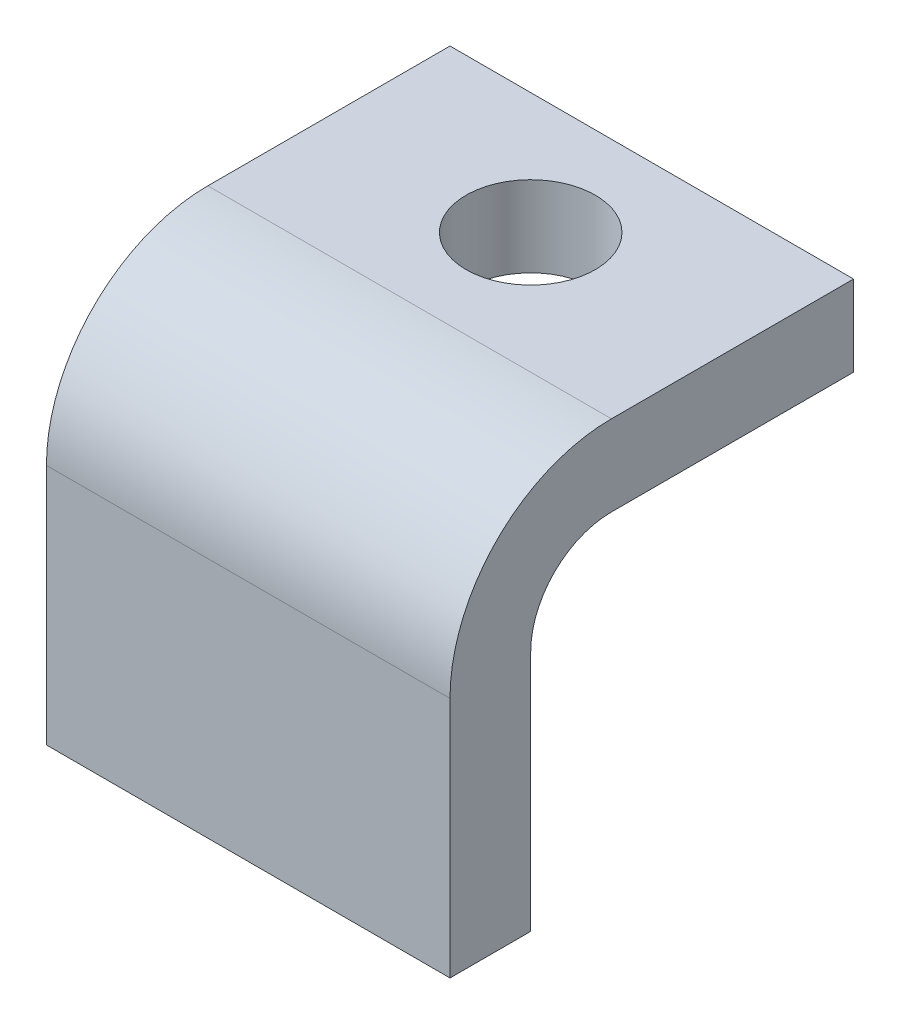
ISO-10303-21;
HEADER;
FILE_DESCRIPTION(('STEP AP214'),'2;1');
FILE_NAME('part.step','',(''),(''),'','','');
FILE_SCHEMA(('AUTOMOTIVE_DESIGN { 1 0 10303 214 1 1 1 1 }'));
ENDSEC;
DATA;
#1=APPLICATION_CONTEXT('core data for automotive mechanical design processes');
#2=APPLICATION_PROTOCOL_DEFINITION('international standard','automotive_design',2000,#1);
#3=PRODUCT_CONTEXT('',#1,'mechanical');
#4=PRODUCT('Part','Part','',(#3));
#5=PRODUCT_RELATED_PRODUCT_CATEGORY('part','',(#4));
#6=PRODUCT_DEFINITION_FORMATION('','',#4);
#7=PRODUCT_DEFINITION_CONTEXT('part definition',#1,'design');
#8=PRODUCT_DEFINITION('design','',#6,#7);
#9=PRODUCT_DEFINITION_SHAPE('','',#8);
#10=(LENGTH_UNIT() NAMED_UNIT(*) SI_UNIT(.MILLI.,.METRE.));
#11=(NAMED_UNIT(*) PLANE_ANGLE_UNIT() SI_UNIT($,.RADIAN.));
#12=(NAMED_UNIT(*) SI_UNIT($,.STERADIAN.) SOLID_ANGLE_UNIT());
#13=UNCERTAINTY_MEASURE_WITH_UNIT(LENGTH_MEASURE(1.E-05),#10,'distance_accuracy_value','');
#14=(GEOMETRIC_REPRESENTATION_CONTEXT(3) GLOBAL_UNCERTAINTY_ASSIGNED_CONTEXT((#13)) GLOBAL_UNIT_ASSIGNED_CONTEXT((#10,
#11,#12)) REPRESENTATION_CONTEXT('',''));
#15=CARTESIAN_POINT('',(0.,0.,0.));
#16=DIRECTION('',(0.,0.,1.));
#17=DIRECTION('',(1.,0.,0.));
#18=AXIS2_PLACEMENT_3D('',#15,#16,#17);
#19=CARTESIAN_POINT('',(5.,8.,-4.));
#20=DIRECTION('',(0.,1.,0.));
#21=DIRECTION('',(0.,0.,1.));
#22=AXIS2_PLACEMENT_3D('',#19,#20,#21);
#23=PLANE('',#22);
#24=CARTESIAN_POINT('',(0.,8.,-7.));
#25=DIRECTION('',(0.,1.,0.));
#26=DIRECTION('',(0.,0.,1.));
#27=AXIS2_PLACEMENT_3D('',#24,#25,#26);
#28=CIRCLE('',#27,1.6);
#29=CARTESIAN_POINT('',(0.,8.,-5.4));
#30=VERTEX_POINT('',#29);
#31=EDGE_CURVE('E136',#30,#30,#28,.T.);
#32=ORIENTED_EDGE('',*,*,#31,.T.);
#33=EDGE_LOOP('',(#32));
#34=FACE_BOUND('',#33,.T.);
#35=DIRECTION('',(0.,0.,-1.));
#36=VECTOR('',#35,1.);
#37=CARTESIAN_POINT('',(-5.,8.,-4.));
#38=LINE('',#37,#36);
#39=CARTESIAN_POINT('',(-5.,8.,-4.));
#40=VERTEX_POINT('',#39);
#41=CARTESIAN_POINT('',(-5.,8.,-10.));
#42=VERTEX_POINT('',#41);
#43=EDGE_CURVE('E132',#40,#42,#38,.T.);
#44=ORIENTED_EDGE('',*,*,#43,.T.);
#45=DIRECTION('',(-1.,0.,0.));
#46=VECTOR('',#45,1.);
#47=CARTESIAN_POINT('',(5.,8.,-10.));
#48=LINE('',#47,#46);
#49=CARTESIAN_POINT('',(5.,8.,-10.));
#50=VERTEX_POINT('',#49);
#51=EDGE_CURVE('E11',#50,#42,#48,.T.);
#52=ORIENTED_EDGE('',*,*,#51,.F.);
#53=DIRECTION('',(0.,0.,-1.));
#54=VECTOR('',#53,1.);
#55=CARTESIAN_POINT('',(5.,8.,-4.));
#56=LINE('',#55,#54);
#57=CARTESIAN_POINT('',(5.,8.,-4.));
#58=VERTEX_POINT('',#57);
#59=EDGE_CURVE('E90',#58,#50,#56,.T.);
#60=ORIENTED_EDGE('',*,*,#59,.F.);
#61=DIRECTION('',(-1.,0.,0.));
#62=VECTOR('',#61,1.);
#63=CARTESIAN_POINT('',(5.,8.,-4.));
#64=LINE('',#63,#62);
#65=EDGE_CURVE('E131',#58,#40,#64,.T.);
#66=ORIENTED_EDGE('',*,*,#65,.T.);
#67=EDGE_LOOP('',(#44,#52,#60,#66));
#68=FACE_BOUND('',#67,.T.);
#69=ADVANCED_FACE('F35',(#34,#68),#23,.F.);
#70=CARTESIAN_POINT('',(5.,10.,-10.));
#71=DIRECTION('',(0.,0.,-1.));
#72=DIRECTION('',(-1.,0.,0.));
#73=AXIS2_PLACEMENT_3D('',#70,#71,#72);
#74=PLANE('',#73);
#75=DIRECTION('',(0.,-1.,0.));
#76=VECTOR('',#75,1.);
#77=CARTESIAN_POINT('',(-5.,10.,-10.));
#78=LINE('',#77,#76);
#79=CARTESIAN_POINT('',(-5.,10.,-10.));
#80=VERTEX_POINT('',#79);
#81=EDGE_CURVE('E135',#80,#42,#78,.T.);
#82=ORIENTED_EDGE('',*,*,#81,.F.);
#83=DIRECTION('',(-1.,0.,0.));
#84=VECTOR('',#83,1.);
#85=CARTESIAN_POINT('',(5.,10.,-10.));
#86=LINE('',#85,#84);
#87=CARTESIAN_POINT('',(5.,10.,-10.));
#88=VERTEX_POINT('',#87);
#89=EDGE_CURVE('E43',#88,#80,#86,.T.);
#90=ORIENTED_EDGE('',*,*,#89,.F.);
#91=DIRECTION('',(0.,-1.,0.));
#92=VECTOR('',#91,1.);
#93=CARTESIAN_POINT('',(5.,10.,-10.));
#94=LINE('',#93,#92);
#95=EDGE_CURVE('E175',#88,#50,#94,.T.);
#96=ORIENTED_EDGE('',*,*,#95,.T.);
#97=ORIENTED_EDGE('',*,*,#51,.T.);
#98=EDGE_LOOP('',(#82,#90,#96,#97));
#99=FACE_BOUND('',#98,.T.);
#100=ADVANCED_FACE('F166',(#99),#74,.T.);
#101=CARTESIAN_POINT('',(5.,10.,-4.));
#102=DIRECTION('',(0.,1.,0.));
#103=DIRECTION('',(0.,0.,1.));
#104=AXIS2_PLACEMENT_3D('',#101,#102,#103);
#105=PLANE('',#104);
#106=CARTESIAN_POINT('',(0.,10.,-7.));
#107=DIRECTION('',(0.,1.,0.));
#108=DIRECTION('',(0.,0.,1.));
#109=AXIS2_PLACEMENT_3D('',#106,#107,#108);
#110=CIRCLE('',#109,1.6);
#111=CARTESIAN_POINT('',(0.,10.,-5.4));
#112=VERTEX_POINT('',#111);
#113=EDGE_CURVE('E182',#112,#112,#110,.T.);
#114=ORIENTED_EDGE('',*,*,#113,.F.);
#115=EDGE_LOOP('',(#114));
#116=FACE_BOUND('',#115,.T.);
#117=DIRECTION('',(0.,0.,-1.));
#118=VECTOR('',#117,1.);
#119=CARTESIAN_POINT('',(-5.,10.,-4.));
#120=LINE('',#119,#118);
#121=CARTESIAN_POINT('',(-5.,10.,-4.));
#122=VERTEX_POINT('',#121);
#123=EDGE_CURVE('E139',#122,#80,#120,.T.);
#124=ORIENTED_EDGE('',*,*,#123,.F.);
#125=DIRECTION('',(-1.,0.,0.));
#126=VECTOR('',#125,1.);
#127=CARTESIAN_POINT('',(5.,10.,-4.));
#128=LINE('',#127,#126);
#129=CARTESIAN_POINT('',(5.,10.,-4.));
#130=VERTEX_POINT('',#129);
#131=EDGE_CURVE('E156',#130,#122,#128,.T.);
#132=ORIENTED_EDGE('',*,*,#131,.F.);
#133=DIRECTION('',(0.,0.,-1.));
#134=VECTOR('',#133,1.);
#135=CARTESIAN_POINT('',(5.,10.,-4.));
#136=LINE('',#135,#134);
#137=EDGE_CURVE('E163',#130,#88,#136,.T.);
#138=ORIENTED_EDGE('',*,*,#137,.T.);
#139=ORIENTED_EDGE('',*,*,#89,.T.);
#140=EDGE_LOOP('',(#124,#132,#138,#139));
#141=FACE_BOUND('',#140,.T.);
#142=ADVANCED_FACE('F161',(#116,#141),#105,.T.);
#143=CARTESIAN_POINT('',(5.,6.,-4.));
#144=DIRECTION('',(-1.,0.,0.));
#145=DIRECTION('',(0.,0.,1.));
#146=AXIS2_PLACEMENT_3D('',#143,#144,#145);
#147=CYLINDRICAL_SURFACE('',#146,4.);
#148=CARTESIAN_POINT('',(-5.,6.,-4.));
#149=DIRECTION('',(-1.,0.,0.));
#150=DIRECTION('',(0.,0.,1.));
#151=AXIS2_PLACEMENT_3D('',#148,#149,#150);
#152=CIRCLE('',#151,4.);
#153=CARTESIAN_POINT('',(-5.,6.,0.));
#154=VERTEX_POINT('',#153);
#155=EDGE_CURVE('E142',#154,#122,#152,.T.);
#156=ORIENTED_EDGE('',*,*,#155,.F.);
#157=DIRECTION('',(-1.,0.,0.));
#158=VECTOR('',#157,1.);
#159=CARTESIAN_POINT('',(5.,6.,0.));
#160=LINE('',#159,#158);
#161=CARTESIAN_POINT('',(5.,6.,0.));
#162=VERTEX_POINT('',#161);
#163=EDGE_CURVE('E154',#162,#154,#160,.T.);
#164=ORIENTED_EDGE('',*,*,#163,.F.);
#165=CARTESIAN_POINT('',(5.,6.,-4.));
#166=DIRECTION('',(-1.,0.,0.));
#167=DIRECTION('',(0.,0.,1.));
#168=AXIS2_PLACEMENT_3D('',#165,#166,#167);
#169=CIRCLE('',#168,4.);
#170=EDGE_CURVE('E126',#162,#130,#169,.T.);
#171=ORIENTED_EDGE('',*,*,#170,.T.);
#172=ORIENTED_EDGE('',*,*,#131,.T.);
#173=EDGE_LOOP('',(#156,#164,#171,#172));
#174=FACE_BOUND('',#173,.T.);
#175=ADVANCED_FACE('F173',(#174),#147,.T.);
#176=CARTESIAN_POINT('',(5.,0.,0.));
#177=DIRECTION('',(0.,0.,1.));
#178=DIRECTION('',(1.,0.,0.));
#179=AXIS2_PLACEMENT_3D('',#176,#177,#178);
#180=PLANE('',#179);
#181=DIRECTION('',(0.,1.,0.));
#182=VECTOR('',#181,1.);
#183=CARTESIAN_POINT('',(-5.,0.,0.));
#184=LINE('',#183,#182);
#185=CARTESIAN_POINT('',(-5.,0.,0.));
#186=VERTEX_POINT('',#185);
#187=EDGE_CURVE('E145',#186,#154,#184,.T.);
#188=ORIENTED_EDGE('',*,*,#187,.F.);
#189=DIRECTION('',(-1.,0.,0.));
#190=VECTOR('',#189,1.);
#191=CARTESIAN_POINT('',(5.,0.,0.));
#192=LINE('',#191,#190);
#193=CARTESIAN_POINT('',(5.,0.,0.));
#194=VERTEX_POINT('',#193);
#195=EDGE_CURVE('E114',#194,#186,#192,.T.);
#196=ORIENTED_EDGE('',*,*,#195,.F.);
#197=DIRECTION('',(0.,1.,0.));
#198=VECTOR('',#197,1.);
#199=CARTESIAN_POINT('',(5.,0.,0.));
#200=LINE('',#199,#198);
#201=EDGE_CURVE('E124',#194,#162,#200,.T.);
#202=ORIENTED_EDGE('',*,*,#201,.T.);
#203=ORIENTED_EDGE('',*,*,#163,.T.);
#204=EDGE_LOOP('',(#188,#196,#202,#203));
#205=FACE_BOUND('',#204,.T.);
#206=ADVANCED_FACE('F194',(#205),#180,.T.);
#207=CARTESIAN_POINT('',(5.,0.,-2.));
#208=DIRECTION('',(0.,-1.,0.));
#209=DIRECTION('',(0.,0.,-1.));
#210=AXIS2_PLACEMENT_3D('',#207,#208,#209);
#211=PLANE('',#210);
#212=DIRECTION('',(0.,0.,1.));
#213=VECTOR('',#212,1.);
#214=CARTESIAN_POINT('',(-5.,0.,-2.));
#215=LINE('',#214,#213);
#216=CARTESIAN_POINT('',(-5.,0.,-2.));
#217=VERTEX_POINT('',#216);
#218=EDGE_CURVE('E113',#217,#186,#215,.T.);
#219=ORIENTED_EDGE('',*,*,#218,.F.);
#220=DIRECTION('',(-1.,0.,0.));
#221=VECTOR('',#220,1.);
#222=CARTESIAN_POINT('',(5.,0.,-2.));
#223=LINE('',#222,#221);
#224=CARTESIAN_POINT('',(5.,0.,-2.));
#225=VERTEX_POINT('',#224);
#226=EDGE_CURVE('E107',#225,#217,#223,.T.);
#227=ORIENTED_EDGE('',*,*,#226,.F.);
#228=DIRECTION('',(0.,0.,1.));
#229=VECTOR('',#228,1.);
#230=CARTESIAN_POINT('',(5.,0.,-2.));
#231=LINE('',#230,#229);
#232=EDGE_CURVE('E111',#225,#194,#231,.T.);
#233=ORIENTED_EDGE('',*,*,#232,.T.);
#234=ORIENTED_EDGE('',*,*,#195,.T.);
#235=EDGE_LOOP('',(#219,#227,#233,#234));
#236=FACE_BOUND('',#235,.T.);
#237=ADVANCED_FACE('F109',(#236),#211,.T.);
#238=CARTESIAN_POINT('',(5.,0.,-2.));
#239=DIRECTION('',(0.,0.,1.));
#240=DIRECTION('',(1.,0.,0.));
#241=AXIS2_PLACEMENT_3D('',#238,#239,#240);
#242=PLANE('',#241);
#243=DIRECTION('',(0.,1.,0.));
#244=VECTOR('',#243,1.);
#245=CARTESIAN_POINT('',(-5.,0.,-2.));
#246=LINE('',#245,#244);
#247=CARTESIAN_POINT('',(-5.,6.,-2.));
#248=VERTEX_POINT('',#247);
#249=EDGE_CURVE('E78',#217,#248,#246,.T.);
#250=ORIENTED_EDGE('',*,*,#249,.T.);
#251=DIRECTION('',(-1.,0.,0.));
#252=VECTOR('',#251,1.);
#253=CARTESIAN_POINT('',(5.,6.,-2.));
#254=LINE('',#253,#252);
#255=CARTESIAN_POINT('',(5.,6.,-2.));
#256=VERTEX_POINT('',#255);
#257=EDGE_CURVE('E115',#256,#248,#254,.T.);
#258=ORIENTED_EDGE('',*,*,#257,.F.);
#259=DIRECTION('',(0.,1.,0.));
#260=VECTOR('',#259,1.);
#261=CARTESIAN_POINT('',(5.,0.,-2.));
#262=LINE('',#261,#260);
#263=EDGE_CURVE('E117',#225,#256,#262,.T.);
#264=ORIENTED_EDGE('',*,*,#263,.F.);
#265=ORIENTED_EDGE('',*,*,#226,.T.);
#266=EDGE_LOOP('',(#250,#258,#264,#265));
#267=FACE_BOUND('',#266,.T.);
#268=ADVANCED_FACE('F118',(#267),#242,.F.);
#269=CARTESIAN_POINT('',(5.,6.,-4.));
#270=DIRECTION('',(-1.,0.,0.));
#271=DIRECTION('',(0.,0.,1.));
#272=AXIS2_PLACEMENT_3D('',#269,#270,#271);
#273=CYLINDRICAL_SURFACE('',#272,2.);
#274=CARTESIAN_POINT('',(-5.,6.,-4.));
#275=DIRECTION('',(1.,0.,0.));
#276=DIRECTION('',(0.,0.,-1.));
#277=AXIS2_PLACEMENT_3D('',#274,#275,#276);
#278=CIRCLE('',#277,2.);
#279=EDGE_CURVE('E84',#248,#40,#278,.F.);
#280=ORIENTED_EDGE('',*,*,#279,.T.);
#281=ORIENTED_EDGE('',*,*,#65,.F.);
#282=CARTESIAN_POINT('',(5.,6.,-4.));
#283=DIRECTION('',(1.,0.,0.));
#284=DIRECTION('',(0.,0.,-1.));
#285=AXIS2_PLACEMENT_3D('',#282,#283,#284);
#286=CIRCLE('',#285,2.);
#287=EDGE_CURVE('E51',#256,#58,#286,.F.);
#288=ORIENTED_EDGE('',*,*,#287,.F.);
#289=ORIENTED_EDGE('',*,*,#257,.T.);
#290=EDGE_LOOP('',(#280,#281,#288,#289));
#291=FACE_BOUND('',#290,.T.);
#292=ADVANCED_FACE('F202',(#291),#273,.F.);
#293=CARTESIAN_POINT('',(5.,6.,-4.));
#294=DIRECTION('',(-1.,0.,0.));
#295=DIRECTION('',(0.,0.,1.));
#296=AXIS2_PLACEMENT_3D('',#293,#294,#295);
#297=PLANE('',#296);
#298=ORIENTED_EDGE('',*,*,#59,.T.);
#299=ORIENTED_EDGE('',*,*,#95,.F.);
#300=ORIENTED_EDGE('',*,*,#137,.F.);
#301=ORIENTED_EDGE('',*,*,#170,.F.);
#302=ORIENTED_EDGE('',*,*,#201,.F.);
#303=ORIENTED_EDGE('',*,*,#232,.F.);
#304=ORIENTED_EDGE('',*,*,#263,.T.);
#305=ORIENTED_EDGE('',*,*,#287,.T.);
#306=EDGE_LOOP('',(#298,#299,#300,#301,#302,#303,#304,#305));
#307=FACE_BOUND('',#306,.T.);
#308=ADVANCED_FACE('F121',(#307),#297,.F.);
#309=CARTESIAN_POINT('',(-5.,6.,-4.));
#310=DIRECTION('',(-1.,0.,0.));
#311=DIRECTION('',(0.,0.,1.));
#312=AXIS2_PLACEMENT_3D('',#309,#310,#311);
#313=PLANE('',#312);
#314=ORIENTED_EDGE('',*,*,#43,.F.);
#315=ORIENTED_EDGE('',*,*,#279,.F.);
#316=ORIENTED_EDGE('',*,*,#249,.F.);
#317=ORIENTED_EDGE('',*,*,#218,.T.);
#318=ORIENTED_EDGE('',*,*,#187,.T.);
#319=ORIENTED_EDGE('',*,*,#155,.T.);
#320=ORIENTED_EDGE('',*,*,#123,.T.);
#321=ORIENTED_EDGE('',*,*,#81,.T.);
#322=EDGE_LOOP('',(#314,#315,#316,#317,#318,#319,#320,#321));
#323=FACE_BOUND('',#322,.T.);
#324=ADVANCED_FACE('F169',(#323),#313,.T.);
#325=CARTESIAN_POINT('',(0.,10.,-7.));
#326=DIRECTION('',(0.,1.,0.));
#327=DIRECTION('',(0.,0.,1.));
#328=AXIS2_PLACEMENT_3D('',#325,#326,#327);
#329=CYLINDRICAL_SURFACE('',#328,1.6);
#330=ORIENTED_EDGE('',*,*,#31,.F.);
#331=EDGE_LOOP('',(#330));
#332=FACE_BOUND('',#331,.T.);
#333=ORIENTED_EDGE('',*,*,#113,.T.);
#334=EDGE_LOOP('',(#333));
#335=FACE_BOUND('',#334,.T.);
#336=ADVANCED_FACE('F186',(#332,#335),#329,.F.);
#337=CLOSED_SHELL('',(#69,#100,#142,#175,#206,#237,#268,#292,#308,#324,#336));
#338=MANIFOLD_SOLID_BREP('B2',#337);
#339=ADVANCED_BREP_SHAPE_REPRESENTATION('',(#18,#338),#14);
#340=SHAPE_DEFINITION_REPRESENTATION(#9,#339);
ENDSEC;
END-ISO-10303-21;
